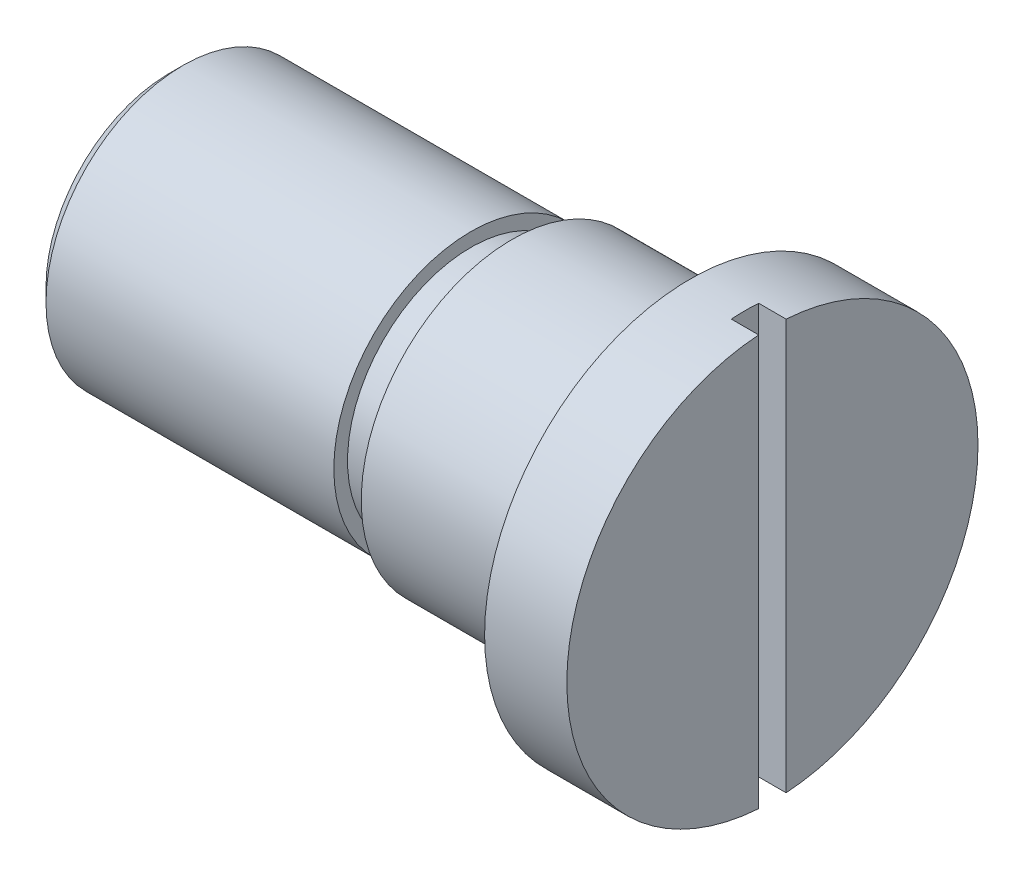
ISO-10303-21;
HEADER;
FILE_DESCRIPTION(('STEP AP214'),'2;1');
FILE_NAME('part.step','',(''),(''),'','','');
FILE_SCHEMA(('AUTOMOTIVE_DESIGN { 1 0 10303 214 1 1 1 1 }'));
ENDSEC;
DATA;
#1=APPLICATION_CONTEXT('core data for automotive mechanical design processes');
#2=APPLICATION_PROTOCOL_DEFINITION('international standard','automotive_design',2000,#1);
#3=PRODUCT_CONTEXT('',#1,'mechanical');
#4=PRODUCT('Part','Part','',(#3));
#5=PRODUCT_RELATED_PRODUCT_CATEGORY('part','',(#4));
#6=PRODUCT_DEFINITION_FORMATION('','',#4);
#7=PRODUCT_DEFINITION_CONTEXT('part definition',#1,'design');
#8=PRODUCT_DEFINITION('design','',#6,#7);
#9=PRODUCT_DEFINITION_SHAPE('','',#8);
#10=(LENGTH_UNIT() NAMED_UNIT(*) SI_UNIT(.MILLI.,.METRE.));
#11=(NAMED_UNIT(*) PLANE_ANGLE_UNIT() SI_UNIT($,.RADIAN.));
#12=(NAMED_UNIT(*) SI_UNIT($,.STERADIAN.) SOLID_ANGLE_UNIT());
#13=UNCERTAINTY_MEASURE_WITH_UNIT(LENGTH_MEASURE(1.E-05),#10,'distance_accuracy_value','');
#14=(GEOMETRIC_REPRESENTATION_CONTEXT(3) GLOBAL_UNCERTAINTY_ASSIGNED_CONTEXT((#13)) GLOBAL_UNIT_ASSIGNED_CONTEXT((#10,
#11,#12)) REPRESENTATION_CONTEXT('',''));
#15=CARTESIAN_POINT('',(0.,0.,0.));
#16=DIRECTION('',(0.,0.,1.));
#17=DIRECTION('',(1.,0.,0.));
#18=AXIS2_PLACEMENT_3D('',#15,#16,#17);
#19=CARTESIAN_POINT('',(0.,0.,0.));
#20=DIRECTION('',(1.,0.,0.));
#21=DIRECTION('',(0.,0.,-1.));
#22=AXIS2_PLACEMENT_3D('',#19,#20,#21);
#23=PLANE('',#22);
#24=CARTESIAN_POINT('',(0.,0.,0.));
#25=DIRECTION('',(1.,0.,0.));
#26=DIRECTION('',(0.,0.,-1.));
#27=AXIS2_PLACEMENT_3D('',#24,#25,#26);
#28=CIRCLE('',#27,15.);
#29=CARTESIAN_POINT('',(0.,14.9666295470958,1.));
#30=VERTEX_POINT('',#29);
#31=CARTESIAN_POINT('',(0.,-14.9666295470958,1.));
#32=VERTEX_POINT('',#31);
#33=EDGE_CURVE('E111',#30,#32,#28,.T.);
#34=ORIENTED_EDGE('',*,*,#33,.T.);
#35=DIRECTION('',(0.,1.,0.));
#36=VECTOR('',#35,1.);
#37=CARTESIAN_POINT('',(0.,-15.,1.));
#38=LINE('',#37,#36);
#39=EDGE_CURVE('E194',#32,#30,#38,.T.);
#40=ORIENTED_EDGE('',*,*,#39,.T.);
#41=EDGE_LOOP('',(#34,#40));
#42=FACE_BOUND('',#41,.T.);
#43=ADVANCED_FACE('F51',(#42),#23,.T.);
#44=DIRECTION('',(0.,1.,0.));
#45=VECTOR('',#44,1.);
#46=CARTESIAN_POINT('',(0.,-15.,-1.));
#47=LINE('',#46,#45);
#48=CARTESIAN_POINT('',(0.,-14.9666295470958,-1.));
#49=VERTEX_POINT('',#48);
#50=CARTESIAN_POINT('',(0.,14.9666295470958,-1.));
#51=VERTEX_POINT('',#50);
#52=EDGE_CURVE('E96',#49,#51,#47,.T.);
#53=ORIENTED_EDGE('',*,*,#52,.F.);
#54=EDGE_CURVE('E110',#49,#51,#28,.T.);
#55=ORIENTED_EDGE('',*,*,#54,.T.);
#56=EDGE_LOOP('',(#53,#55));
#57=FACE_BOUND('',#56,.T.);
#58=ADVANCED_FACE('F106',(#57),#23,.T.);
#59=CARTESIAN_POINT('',(0.,0.,0.));
#60=DIRECTION('',(1.,0.,0.));
#61=DIRECTION('',(0.,0.,-1.));
#62=AXIS2_PLACEMENT_3D('',#59,#60,#61);
#63=CYLINDRICAL_SURFACE('',#62,15.);
#64=DIRECTION('',(1.,0.,0.));
#65=VECTOR('',#64,1.);
#66=CARTESIAN_POINT('',(0.,-14.9666295470958,1.));
#67=LINE('',#66,#65);
#68=CARTESIAN_POINT('',(-2.,-14.9666295470958,1.));
#69=VERTEX_POINT('',#68);
#70=EDGE_CURVE('E135',#32,#69,#67,.F.);
#71=ORIENTED_EDGE('',*,*,#70,.F.);
#72=ORIENTED_EDGE('',*,*,#33,.F.);
#73=DIRECTION('',(1.,0.,0.));
#74=VECTOR('',#73,1.);
#75=CARTESIAN_POINT('',(0.,14.9666295470958,1.));
#76=LINE('',#75,#74);
#77=CARTESIAN_POINT('',(-2.,14.9666295470958,1.));
#78=VERTEX_POINT('',#77);
#79=EDGE_CURVE('E130',#78,#30,#76,.T.);
#80=ORIENTED_EDGE('',*,*,#79,.F.);
#81=CARTESIAN_POINT('',(-2.,0.,0.));
#82=DIRECTION('',(-1.,0.,0.));
#83=DIRECTION('',(0.,0.,1.));
#84=AXIS2_PLACEMENT_3D('',#81,#82,#83);
#85=CIRCLE('',#84,15.);
#86=CARTESIAN_POINT('',(-2.,14.9666295470958,-1.));
#87=VERTEX_POINT('',#86);
#88=EDGE_CURVE('E73',#87,#78,#85,.F.);
#89=ORIENTED_EDGE('',*,*,#88,.F.);
#90=DIRECTION('',(1.,0.,0.));
#91=VECTOR('',#90,1.);
#92=CARTESIAN_POINT('',(0.,14.9666295470958,-1.));
#93=LINE('',#92,#91);
#94=EDGE_CURVE('E101',#51,#87,#93,.F.);
#95=ORIENTED_EDGE('',*,*,#94,.F.);
#96=ORIENTED_EDGE('',*,*,#54,.F.);
#97=DIRECTION('',(1.,0.,0.));
#98=VECTOR('',#97,1.);
#99=CARTESIAN_POINT('',(0.,-14.9666295470958,-1.));
#100=LINE('',#99,#98);
#101=CARTESIAN_POINT('',(-2.,-14.9666295470958,-1.));
#102=VERTEX_POINT('',#101);
#103=EDGE_CURVE('E91',#102,#49,#100,.T.);
#104=ORIENTED_EDGE('',*,*,#103,.F.);
#105=EDGE_CURVE('E105',#69,#102,#85,.F.);
#106=ORIENTED_EDGE('',*,*,#105,.F.);
#107=EDGE_LOOP('',(#71,#72,#80,#89,#95,#96,#104,#106));
#108=FACE_BOUND('',#107,.T.);
#109=CARTESIAN_POINT('',(-6.,0.,0.));
#110=DIRECTION('',(1.,0.,0.));
#111=DIRECTION('',(0.,0.,-1.));
#112=AXIS2_PLACEMENT_3D('',#109,#110,#111);
#113=CIRCLE('',#112,15.);
#114=CARTESIAN_POINT('',(-6.,0.,-15.));
#115=VERTEX_POINT('',#114);
#116=EDGE_CURVE('E113',#115,#115,#113,.T.);
#117=ORIENTED_EDGE('',*,*,#116,.T.);
#118=EDGE_LOOP('',(#117));
#119=FACE_BOUND('',#118,.T.);
#120=ADVANCED_FACE('F112',(#108,#119),#63,.T.);
#121=CARTESIAN_POINT('',(-6.,15.,0.));
#122=DIRECTION('',(-1.,0.,0.));
#123=DIRECTION('',(0.,0.,1.));
#124=AXIS2_PLACEMENT_3D('',#121,#122,#123);
#125=PLANE('',#124);
#126=CARTESIAN_POINT('',(-6.,0.,0.));
#127=DIRECTION('',(1.,0.,0.));
#128=DIRECTION('',(0.,0.,-1.));
#129=AXIS2_PLACEMENT_3D('',#126,#127,#128);
#130=CIRCLE('',#129,11.);
#131=CARTESIAN_POINT('',(-6.,0.,-11.));
#132=VERTEX_POINT('',#131);
#133=EDGE_CURVE('E123',#132,#132,#130,.T.);
#134=ORIENTED_EDGE('',*,*,#133,.T.);
#135=EDGE_LOOP('',(#134));
#136=FACE_BOUND('',#135,.T.);
#137=ORIENTED_EDGE('',*,*,#116,.F.);
#138=EDGE_LOOP('',(#137));
#139=FACE_BOUND('',#138,.T.);
#140=ADVANCED_FACE('F159',(#136,#139),#125,.T.);
#141=CARTESIAN_POINT('',(0.,0.,0.));
#142=DIRECTION('',(1.,0.,0.));
#143=DIRECTION('',(0.,0.,-1.));
#144=AXIS2_PLACEMENT_3D('',#141,#142,#143);
#145=CYLINDRICAL_SURFACE('',#144,11.);
#146=CARTESIAN_POINT('',(-19.,0.,0.));
#147=DIRECTION('',(1.,0.,0.));
#148=DIRECTION('',(0.,0.,-1.));
#149=AXIS2_PLACEMENT_3D('',#146,#147,#148);
#150=CIRCLE('',#149,11.);
#151=CARTESIAN_POINT('',(-19.,0.,-11.));
#152=VERTEX_POINT('',#151);
#153=EDGE_CURVE('E214',#152,#152,#150,.T.);
#154=ORIENTED_EDGE('',*,*,#153,.T.);
#155=EDGE_LOOP('',(#154));
#156=FACE_BOUND('',#155,.T.);
#157=ORIENTED_EDGE('',*,*,#133,.F.);
#158=EDGE_LOOP('',(#157));
#159=FACE_BOUND('',#158,.T.);
#160=ADVANCED_FACE('F162',(#156,#159),#145,.T.);
#161=CARTESIAN_POINT('',(-19.,11.,0.));
#162=DIRECTION('',(-1.,0.,0.));
#163=DIRECTION('',(0.,0.,1.));
#164=AXIS2_PLACEMENT_3D('',#161,#162,#163);
#165=PLANE('',#164);
#166=CARTESIAN_POINT('',(-19.,0.,0.));
#167=DIRECTION('',(1.,0.,0.));
#168=DIRECTION('',(0.,0.,-1.));
#169=AXIS2_PLACEMENT_3D('',#166,#167,#168);
#170=CIRCLE('',#169,9.);
#171=CARTESIAN_POINT('',(-19.,0.,-9.));
#172=VERTEX_POINT('',#171);
#173=EDGE_CURVE('E211',#172,#172,#170,.T.);
#174=ORIENTED_EDGE('',*,*,#173,.T.);
#175=EDGE_LOOP('',(#174));
#176=FACE_BOUND('',#175,.T.);
#177=ORIENTED_EDGE('',*,*,#153,.F.);
#178=EDGE_LOOP('',(#177));
#179=FACE_BOUND('',#178,.T.);
#180=ADVANCED_FACE('F170',(#176,#179),#165,.T.);
#181=CARTESIAN_POINT('',(0.,0.,0.));
#182=DIRECTION('',(1.,0.,0.));
#183=DIRECTION('',(0.,0.,-1.));
#184=AXIS2_PLACEMENT_3D('',#181,#182,#183);
#185=CYLINDRICAL_SURFACE('',#184,9.);
#186=CARTESIAN_POINT('',(-22.,0.,0.));
#187=DIRECTION('',(1.,0.,0.));
#188=DIRECTION('',(0.,0.,-1.));
#189=AXIS2_PLACEMENT_3D('',#186,#187,#188);
#190=CIRCLE('',#189,9.);
#191=CARTESIAN_POINT('',(-22.,0.,-9.));
#192=VERTEX_POINT('',#191);
#193=EDGE_CURVE('E210',#192,#192,#190,.T.);
#194=ORIENTED_EDGE('',*,*,#193,.T.);
#195=EDGE_LOOP('',(#194));
#196=FACE_BOUND('',#195,.T.);
#197=ORIENTED_EDGE('',*,*,#173,.F.);
#198=EDGE_LOOP('',(#197));
#199=FACE_BOUND('',#198,.T.);
#200=ADVANCED_FACE('F172',(#196,#199),#185,.T.);
#201=CARTESIAN_POINT('',(-22.,9.,0.));
#202=DIRECTION('',(1.,0.,0.));
#203=DIRECTION('',(0.,0.,-1.));
#204=AXIS2_PLACEMENT_3D('',#201,#202,#203);
#205=PLANE('',#204);
#206=CARTESIAN_POINT('',(-22.,0.,0.));
#207=DIRECTION('',(1.,0.,0.));
#208=DIRECTION('',(0.,0.,-1.));
#209=AXIS2_PLACEMENT_3D('',#206,#207,#208);
#210=CIRCLE('',#209,9.99999999999999);
#211=CARTESIAN_POINT('',(-22.,0.,-9.99999999999999));
#212=VERTEX_POINT('',#211);
#213=EDGE_CURVE('E199',#212,#212,#210,.T.);
#214=ORIENTED_EDGE('',*,*,#213,.T.);
#215=EDGE_LOOP('',(#214));
#216=FACE_BOUND('',#215,.T.);
#217=ORIENTED_EDGE('',*,*,#193,.F.);
#218=EDGE_LOOP('',(#217));
#219=FACE_BOUND('',#218,.T.);
#220=ADVANCED_FACE('F173',(#216,#219),#205,.T.);
#221=CARTESIAN_POINT('',(0.,0.,0.));
#222=DIRECTION('',(1.,0.,0.));
#223=DIRECTION('',(0.,0.,-1.));
#224=AXIS2_PLACEMENT_3D('',#221,#222,#223);
#225=CYLINDRICAL_SURFACE('',#224,9.99999999999999);
#226=CARTESIAN_POINT('',(-43.,0.,0.));
#227=DIRECTION('',(-1.,0.,0.));
#228=DIRECTION('',(0.,0.,1.));
#229=AXIS2_PLACEMENT_3D('',#226,#227,#228);
#230=CIRCLE('',#229,9.99999999999999);
#231=CARTESIAN_POINT('',(-43.,0.,9.99999999999999));
#232=VERTEX_POINT('',#231);
#233=EDGE_CURVE('E62',#232,#232,#230,.F.);
#234=ORIENTED_EDGE('',*,*,#233,.T.);
#235=EDGE_LOOP('',(#234));
#236=FACE_BOUND('',#235,.T.);
#237=ORIENTED_EDGE('',*,*,#213,.F.);
#238=EDGE_LOOP('',(#237));
#239=FACE_BOUND('',#238,.T.);
#240=ADVANCED_FACE('F139',(#236,#239),#225,.T.);
#241=CARTESIAN_POINT('',(-44.,9.99999999999999,0.));
#242=DIRECTION('',(-1.,0.,0.));
#243=DIRECTION('',(0.,0.,1.));
#244=AXIS2_PLACEMENT_3D('',#241,#242,#243);
#245=PLANE('',#244);
#246=CARTESIAN_POINT('',(-44.,0.,0.));
#247=DIRECTION('',(-1.,0.,0.));
#248=DIRECTION('',(0.,0.,1.));
#249=AXIS2_PLACEMENT_3D('',#246,#247,#248);
#250=CIRCLE('',#249,8.99999999999999);
#251=CARTESIAN_POINT('',(-44.,0.,8.99999999999999));
#252=VERTEX_POINT('',#251);
#253=EDGE_CURVE('E11',#252,#252,#250,.T.);
#254=ORIENTED_EDGE('',*,*,#253,.T.);
#255=EDGE_LOOP('',(#254));
#256=FACE_BOUND('',#255,.T.);
#257=ADVANCED_FACE('F177',(#256),#245,.T.);
#258=CARTESIAN_POINT('',(-2.,-15.,1.));
#259=DIRECTION('',(0.,0.,1.));
#260=DIRECTION('',(1.,0.,0.));
#261=AXIS2_PLACEMENT_3D('',#258,#259,#260);
#262=PLANE('',#261);
#263=ORIENTED_EDGE('',*,*,#70,.T.);
#264=DIRECTION('',(0.,1.,0.));
#265=VECTOR('',#264,1.);
#266=CARTESIAN_POINT('',(-2.,-15.,1.));
#267=LINE('',#266,#265);
#268=EDGE_CURVE('E193',#69,#78,#267,.T.);
#269=ORIENTED_EDGE('',*,*,#268,.T.);
#270=ORIENTED_EDGE('',*,*,#79,.T.);
#271=ORIENTED_EDGE('',*,*,#39,.F.);
#272=EDGE_LOOP('',(#263,#269,#270,#271));
#273=FACE_BOUND('',#272,.T.);
#274=ADVANCED_FACE('F185',(#273),#262,.F.);
#275=CARTESIAN_POINT('',(-2.,-15.,-1.));
#276=DIRECTION('',(-1.,0.,0.));
#277=DIRECTION('',(0.,0.,1.));
#278=AXIS2_PLACEMENT_3D('',#275,#276,#277);
#279=PLANE('',#278);
#280=ORIENTED_EDGE('',*,*,#268,.F.);
#281=ORIENTED_EDGE('',*,*,#105,.T.);
#282=DIRECTION('',(0.,1.,0.));
#283=VECTOR('',#282,1.);
#284=CARTESIAN_POINT('',(-2.,-15.,-1.));
#285=LINE('',#284,#283);
#286=EDGE_CURVE('E66',#102,#87,#285,.T.);
#287=ORIENTED_EDGE('',*,*,#286,.T.);
#288=ORIENTED_EDGE('',*,*,#88,.T.);
#289=EDGE_LOOP('',(#280,#281,#287,#288));
#290=FACE_BOUND('',#289,.T.);
#291=ADVANCED_FACE('F146',(#290),#279,.F.);
#292=CARTESIAN_POINT('',(0.,-15.,-1.));
#293=DIRECTION('',(0.,0.,-1.));
#294=DIRECTION('',(-1.,0.,0.));
#295=AXIS2_PLACEMENT_3D('',#292,#293,#294);
#296=PLANE('',#295);
#297=ORIENTED_EDGE('',*,*,#94,.T.);
#298=ORIENTED_EDGE('',*,*,#286,.F.);
#299=ORIENTED_EDGE('',*,*,#103,.T.);
#300=ORIENTED_EDGE('',*,*,#52,.T.);
#301=EDGE_LOOP('',(#297,#298,#299,#300));
#302=FACE_BOUND('',#301,.T.);
#303=ADVANCED_FACE('F92',(#302),#296,.F.);
#304=CARTESIAN_POINT('',(-43.,0.,0.));
#305=DIRECTION('',(1.,0.,0.));
#306=DIRECTION('',(0.,0.,-1.));
#307=AXIS2_PLACEMENT_3D('',#304,#305,#306);
#308=CONICAL_SURFACE('',#307,9.99999999999999,0.785398163397451);
#309=ORIENTED_EDGE('',*,*,#253,.F.);
#310=EDGE_LOOP('',(#309));
#311=FACE_BOUND('',#310,.T.);
#312=ORIENTED_EDGE('',*,*,#233,.F.);
#313=EDGE_LOOP('',(#312));
#314=FACE_BOUND('',#313,.T.);
#315=ADVANCED_FACE('F53',(#311,#314),#308,.T.);
#316=CLOSED_SHELL('',(#43,#58,#120,#140,#160,#180,#200,#220,#240,#257,#274,#291,#303,#315));
#317=MANIFOLD_SOLID_BREP('B2',#316);
#318=ADVANCED_BREP_SHAPE_REPRESENTATION('',(#18,#317),#14);
#319=SHAPE_DEFINITION_REPRESENTATION(#9,#318);
ENDSEC;
END-ISO-10303-21;
